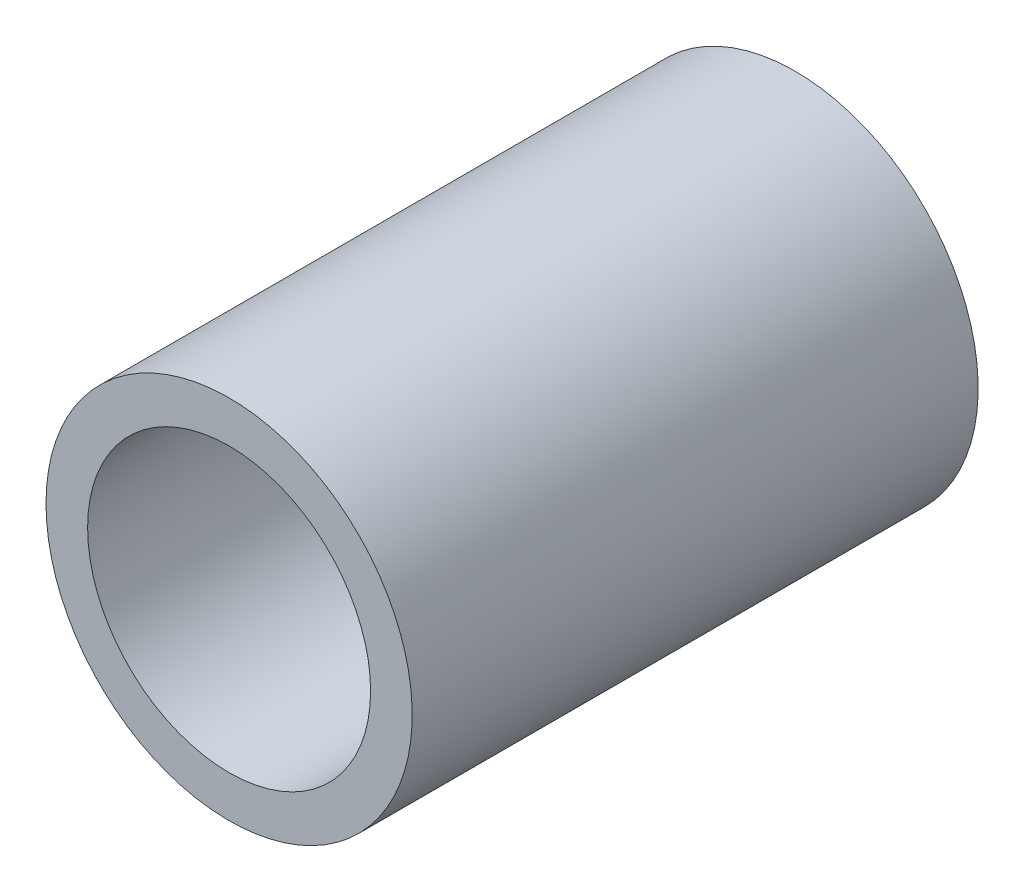
ISO-10303-21;
HEADER;
FILE_DESCRIPTION(('STEP AP214'),'2;1');
FILE_NAME('part.step','',(''),(''),'','','');
FILE_SCHEMA(('AUTOMOTIVE_DESIGN { 1 0 10303 214 1 1 1 1 }'));
ENDSEC;
DATA;
#1=APPLICATION_CONTEXT('core data for automotive mechanical design processes');
#2=APPLICATION_PROTOCOL_DEFINITION('international standard','automotive_design',2000,#1);
#3=PRODUCT_CONTEXT('',#1,'mechanical');
#4=PRODUCT('Part','Part','',(#3));
#5=PRODUCT_RELATED_PRODUCT_CATEGORY('part','',(#4));
#6=PRODUCT_DEFINITION_FORMATION('','',#4);
#7=PRODUCT_DEFINITION_CONTEXT('part definition',#1,'design');
#8=PRODUCT_DEFINITION('design','',#6,#7);
#9=PRODUCT_DEFINITION_SHAPE('','',#8);
#10=(LENGTH_UNIT() NAMED_UNIT(*) SI_UNIT(.MILLI.,.METRE.));
#11=(NAMED_UNIT(*) PLANE_ANGLE_UNIT() SI_UNIT($,.RADIAN.));
#12=(NAMED_UNIT(*) SI_UNIT($,.STERADIAN.) SOLID_ANGLE_UNIT());
#13=UNCERTAINTY_MEASURE_WITH_UNIT(LENGTH_MEASURE(1.E-05),#10,'distance_accuracy_value','');
#14=(GEOMETRIC_REPRESENTATION_CONTEXT(3) GLOBAL_UNCERTAINTY_ASSIGNED_CONTEXT((#13)) GLOBAL_UNIT_ASSIGNED_CONTEXT((#10,
#11,#12)) REPRESENTATION_CONTEXT('',''));
#15=CARTESIAN_POINT('',(0.,0.,0.));
#16=DIRECTION('',(0.,0.,1.));
#17=DIRECTION('',(1.,0.,0.));
#18=AXIS2_PLACEMENT_3D('',#15,#16,#17);
#19=CARTESIAN_POINT('',(0.,0.,17.));
#20=DIRECTION('',(0.,0.,-1.));
#21=DIRECTION('',(-1.,0.,0.));
#22=AXIS2_PLACEMENT_3D('',#19,#20,#21);
#23=CYLINDRICAL_SURFACE('',#22,4.25);
#24=CARTESIAN_POINT('',(0.,0.,0.));
#25=DIRECTION('',(0.,0.,-1.));
#26=DIRECTION('',(-1.,0.,0.));
#27=AXIS2_PLACEMENT_3D('',#24,#25,#26);
#28=CIRCLE('',#27,4.25);
#29=CARTESIAN_POINT('',(-4.25,0.,0.));
#30=VERTEX_POINT('',#29);
#31=EDGE_CURVE('E18',#30,#30,#28,.T.);
#32=ORIENTED_EDGE('',*,*,#31,.T.);
#33=EDGE_LOOP('',(#32));
#34=FACE_BOUND('',#33,.T.);
#35=CARTESIAN_POINT('',(0.,0.,17.));
#36=DIRECTION('',(0.,0.,-1.));
#37=DIRECTION('',(-1.,0.,0.));
#38=AXIS2_PLACEMENT_3D('',#35,#36,#37);
#39=CIRCLE('',#38,4.25);
#40=CARTESIAN_POINT('',(-4.25,0.,17.));
#41=VERTEX_POINT('',#40);
#42=EDGE_CURVE('E27',#41,#41,#39,.T.);
#43=ORIENTED_EDGE('',*,*,#42,.F.);
#44=EDGE_LOOP('',(#43));
#45=FACE_BOUND('',#44,.T.);
#46=ADVANCED_FACE('F15',(#34,#45),#23,.F.);
#47=CARTESIAN_POINT('',(0.,0.,0.));
#48=DIRECTION('',(0.,0.,1.));
#49=DIRECTION('',(1.,0.,0.));
#50=AXIS2_PLACEMENT_3D('',#47,#48,#49);
#51=PLANE('',#50);
#52=ORIENTED_EDGE('',*,*,#31,.F.);
#53=EDGE_LOOP('',(#52));
#54=FACE_BOUND('',#53,.T.);
#55=CARTESIAN_POINT('',(0.,0.,0.));
#56=DIRECTION('',(0.,0.,-1.));
#57=DIRECTION('',(-1.,0.,0.));
#58=AXIS2_PLACEMENT_3D('',#55,#56,#57);
#59=CIRCLE('',#58,5.5);
#60=CARTESIAN_POINT('',(-5.5,0.,0.));
#61=VERTEX_POINT('',#60);
#62=EDGE_CURVE('E22',#61,#61,#59,.F.);
#63=ORIENTED_EDGE('',*,*,#62,.F.);
#64=EDGE_LOOP('',(#63));
#65=FACE_BOUND('',#64,.T.);
#66=ADVANCED_FACE('F37',(#54,#65),#51,.F.);
#67=CARTESIAN_POINT('',(0.,0.,17.));
#68=DIRECTION('',(0.,0.,1.));
#69=DIRECTION('',(1.,0.,0.));
#70=AXIS2_PLACEMENT_3D('',#67,#68,#69);
#71=PLANE('',#70);
#72=ORIENTED_EDGE('',*,*,#42,.T.);
#73=EDGE_LOOP('',(#72));
#74=FACE_BOUND('',#73,.T.);
#75=CARTESIAN_POINT('',(0.,0.,17.));
#76=DIRECTION('',(0.,0.,-1.));
#77=DIRECTION('',(-1.,0.,0.));
#78=AXIS2_PLACEMENT_3D('',#75,#76,#77);
#79=CIRCLE('',#78,5.5);
#80=CARTESIAN_POINT('',(-5.5,0.,17.));
#81=VERTEX_POINT('',#80);
#82=EDGE_CURVE('E10',#81,#81,#79,.T.);
#83=ORIENTED_EDGE('',*,*,#82,.F.);
#84=EDGE_LOOP('',(#83));
#85=FACE_BOUND('',#84,.T.);
#86=ADVANCED_FACE('F40',(#74,#85),#71,.T.);
#87=CARTESIAN_POINT('',(0.,0.,17.));
#88=DIRECTION('',(0.,0.,-1.));
#89=DIRECTION('',(-1.,0.,0.));
#90=AXIS2_PLACEMENT_3D('',#87,#88,#89);
#91=CYLINDRICAL_SURFACE('',#90,5.5);
#92=ORIENTED_EDGE('',*,*,#82,.T.);
#93=EDGE_LOOP('',(#92));
#94=FACE_BOUND('',#93,.T.);
#95=ORIENTED_EDGE('',*,*,#62,.T.);
#96=EDGE_LOOP('',(#95));
#97=FACE_BOUND('',#96,.T.);
#98=ADVANCED_FACE('F43',(#94,#97),#91,.T.);
#99=CLOSED_SHELL('',(#46,#66,#86,#98));
#100=MANIFOLD_SOLID_BREP('B1',#99);
#101=ADVANCED_BREP_SHAPE_REPRESENTATION('',(#18,#100),#14);
#102=SHAPE_DEFINITION_REPRESENTATION(#9,#101);
ENDSEC;
END-ISO-10303-21;
